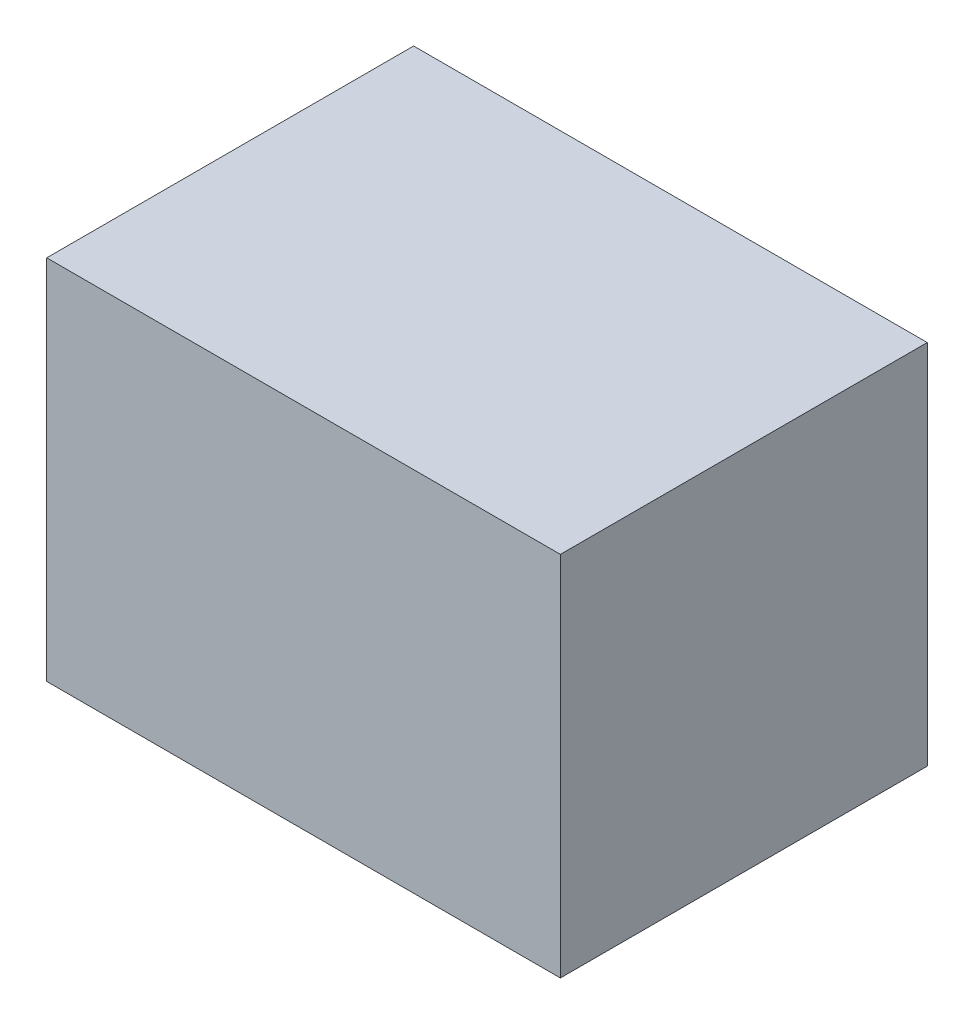
ISO-10303-21;
HEADER;
FILE_DESCRIPTION(('STEP AP214'),'2;1');
FILE_NAME('part.step','',(''),(''),'','','');
FILE_SCHEMA(('AUTOMOTIVE_DESIGN { 1 0 10303 214 1 1 1 1 }'));
ENDSEC;
DATA;
#1=APPLICATION_CONTEXT('core data for automotive mechanical design processes');
#2=APPLICATION_PROTOCOL_DEFINITION('international standard','automotive_design',2000,#1);
#3=PRODUCT_CONTEXT('',#1,'mechanical');
#4=PRODUCT('Part','Part','',(#3));
#5=PRODUCT_RELATED_PRODUCT_CATEGORY('part','',(#4));
#6=PRODUCT_DEFINITION_FORMATION('','',#4);
#7=PRODUCT_DEFINITION_CONTEXT('part definition',#1,'design');
#8=PRODUCT_DEFINITION('design','',#6,#7);
#9=PRODUCT_DEFINITION_SHAPE('','',#8);
#10=(LENGTH_UNIT() NAMED_UNIT(*) SI_UNIT(.MILLI.,.METRE.));
#11=(NAMED_UNIT(*) PLANE_ANGLE_UNIT() SI_UNIT($,.RADIAN.));
#12=(NAMED_UNIT(*) SI_UNIT($,.STERADIAN.) SOLID_ANGLE_UNIT());
#13=UNCERTAINTY_MEASURE_WITH_UNIT(LENGTH_MEASURE(1.E-05),#10,'distance_accuracy_value','');
#14=(GEOMETRIC_REPRESENTATION_CONTEXT(3) GLOBAL_UNCERTAINTY_ASSIGNED_CONTEXT((#13)) GLOBAL_UNIT_ASSIGNED_CONTEXT((#10,
#11,#12)) REPRESENTATION_CONTEXT('',''));
#15=CARTESIAN_POINT('',(0.,0.,0.));
#16=DIRECTION('',(0.,0.,1.));
#17=DIRECTION('',(1.,0.,0.));
#18=AXIS2_PLACEMENT_3D('',#15,#16,#17);
#19=CARTESIAN_POINT('',(53.34,0.,0.));
#20=DIRECTION('',(0.,0.,-1.));
#21=DIRECTION('',(-1.,0.,0.));
#22=AXIS2_PLACEMENT_3D('',#19,#20,#21);
#23=PLANE('',#22);
#24=DIRECTION('',(0.,-1.,0.));
#25=VECTOR('',#24,1.);
#26=CARTESIAN_POINT('',(0.,0.,0.));
#27=LINE('',#26,#25);
#28=CARTESIAN_POINT('',(0.,38.1,0.));
#29=VERTEX_POINT('',#28);
#30=CARTESIAN_POINT('',(0.,0.,0.));
#31=VERTEX_POINT('',#30);
#32=EDGE_CURVE('E113',#29,#31,#27,.T.);
#33=ORIENTED_EDGE('',*,*,#32,.T.);
#34=DIRECTION('',(-1.,0.,0.));
#35=VECTOR('',#34,1.);
#36=CARTESIAN_POINT('',(53.34,0.,0.));
#37=LINE('',#36,#35);
#38=CARTESIAN_POINT('',(53.34,0.,0.));
#39=VERTEX_POINT('',#38);
#40=EDGE_CURVE('E11',#39,#31,#37,.T.);
#41=ORIENTED_EDGE('',*,*,#40,.F.);
#42=DIRECTION('',(0.,-1.,0.));
#43=VECTOR('',#42,1.);
#44=CARTESIAN_POINT('',(53.34,0.,0.));
#45=LINE('',#44,#43);
#46=CARTESIAN_POINT('',(53.34,38.1,0.));
#47=VERTEX_POINT('',#46);
#48=EDGE_CURVE('E97',#47,#39,#45,.T.);
#49=ORIENTED_EDGE('',*,*,#48,.F.);
#50=DIRECTION('',(-1.,0.,0.));
#51=VECTOR('',#50,1.);
#52=CARTESIAN_POINT('',(53.34,38.1,0.));
#53=LINE('',#52,#51);
#54=EDGE_CURVE('E109',#47,#29,#53,.T.);
#55=ORIENTED_EDGE('',*,*,#54,.T.);
#56=EDGE_LOOP('',(#33,#41,#49,#55));
#57=FACE_BOUND('',#56,.T.);
#58=ADVANCED_FACE('F45',(#57),#23,.F.);
#59=CARTESIAN_POINT('',(53.34,0.,0.));
#60=DIRECTION('',(0.,1.,0.));
#61=DIRECTION('',(0.,0.,1.));
#62=AXIS2_PLACEMENT_3D('',#59,#60,#61);
#63=PLANE('',#62);
#64=DIRECTION('',(0.,0.,-1.));
#65=VECTOR('',#64,1.);
#66=CARTESIAN_POINT('',(0.,0.,0.));
#67=LINE('',#66,#65);
#68=CARTESIAN_POINT('',(0.,0.,-38.1));
#69=VERTEX_POINT('',#68);
#70=EDGE_CURVE('E102',#31,#69,#67,.T.);
#71=ORIENTED_EDGE('',*,*,#70,.T.);
#72=DIRECTION('',(-1.,0.,0.));
#73=VECTOR('',#72,1.);
#74=CARTESIAN_POINT('',(53.34,0.,-38.1));
#75=LINE('',#74,#73);
#76=CARTESIAN_POINT('',(53.34,0.,-38.1));
#77=VERTEX_POINT('',#76);
#78=EDGE_CURVE('E54',#77,#69,#75,.T.);
#79=ORIENTED_EDGE('',*,*,#78,.F.);
#80=DIRECTION('',(0.,0.,-1.));
#81=VECTOR('',#80,1.);
#82=CARTESIAN_POINT('',(53.34,0.,0.));
#83=LINE('',#82,#81);
#84=EDGE_CURVE('E92',#39,#77,#83,.T.);
#85=ORIENTED_EDGE('',*,*,#84,.F.);
#86=ORIENTED_EDGE('',*,*,#40,.T.);
#87=EDGE_LOOP('',(#71,#79,#85,#86));
#88=FACE_BOUND('',#87,.T.);
#89=ADVANCED_FACE('F101',(#88),#63,.F.);
#90=CARTESIAN_POINT('',(53.34,0.,-38.1));
#91=DIRECTION('',(0.,0.,1.));
#92=DIRECTION('',(1.,0.,0.));
#93=AXIS2_PLACEMENT_3D('',#90,#91,#92);
#94=PLANE('',#93);
#95=DIRECTION('',(0.,1.,0.));
#96=VECTOR('',#95,1.);
#97=CARTESIAN_POINT('',(0.,0.,-38.1));
#98=LINE('',#97,#96);
#99=CARTESIAN_POINT('',(0.,38.1,-38.1));
#100=VERTEX_POINT('',#99);
#101=EDGE_CURVE('E79',#69,#100,#98,.T.);
#102=ORIENTED_EDGE('',*,*,#101,.T.);
#103=DIRECTION('',(-1.,0.,0.));
#104=VECTOR('',#103,1.);
#105=CARTESIAN_POINT('',(53.34,38.1,-38.1));
#106=LINE('',#105,#104);
#107=CARTESIAN_POINT('',(53.34,38.1,-38.1));
#108=VERTEX_POINT('',#107);
#109=EDGE_CURVE('E104',#108,#100,#106,.T.);
#110=ORIENTED_EDGE('',*,*,#109,.F.);
#111=DIRECTION('',(0.,1.,0.));
#112=VECTOR('',#111,1.);
#113=CARTESIAN_POINT('',(53.34,0.,-38.1));
#114=LINE('',#113,#112);
#115=EDGE_CURVE('E95',#77,#108,#114,.T.);
#116=ORIENTED_EDGE('',*,*,#115,.F.);
#117=ORIENTED_EDGE('',*,*,#78,.T.);
#118=EDGE_LOOP('',(#102,#110,#116,#117));
#119=FACE_BOUND('',#118,.T.);
#120=ADVANCED_FACE('F105',(#119),#94,.F.);
#121=CARTESIAN_POINT('',(53.34,38.1,0.));
#122=DIRECTION('',(0.,-1.,0.));
#123=DIRECTION('',(0.,0.,-1.));
#124=AXIS2_PLACEMENT_3D('',#121,#122,#123);
#125=PLANE('',#124);
#126=DIRECTION('',(0.,0.,1.));
#127=VECTOR('',#126,1.);
#128=CARTESIAN_POINT('',(0.,38.1,0.));
#129=LINE('',#128,#127);
#130=EDGE_CURVE('E85',#100,#29,#129,.T.);
#131=ORIENTED_EDGE('',*,*,#130,.T.);
#132=ORIENTED_EDGE('',*,*,#54,.F.);
#133=DIRECTION('',(0.,0.,1.));
#134=VECTOR('',#133,1.);
#135=CARTESIAN_POINT('',(53.34,38.1,0.));
#136=LINE('',#135,#134);
#137=EDGE_CURVE('E62',#108,#47,#136,.T.);
#138=ORIENTED_EDGE('',*,*,#137,.F.);
#139=ORIENTED_EDGE('',*,*,#109,.T.);
#140=EDGE_LOOP('',(#131,#132,#138,#139));
#141=FACE_BOUND('',#140,.T.);
#142=ADVANCED_FACE('F126',(#141),#125,.F.);
#143=CARTESIAN_POINT('',(53.34,0.,0.));
#144=DIRECTION('',(-1.,0.,0.));
#145=DIRECTION('',(0.,0.,1.));
#146=AXIS2_PLACEMENT_3D('',#143,#144,#145);
#147=PLANE('',#146);
#148=ORIENTED_EDGE('',*,*,#48,.T.);
#149=ORIENTED_EDGE('',*,*,#84,.T.);
#150=ORIENTED_EDGE('',*,*,#115,.T.);
#151=ORIENTED_EDGE('',*,*,#137,.T.);
#152=EDGE_LOOP('',(#148,#149,#150,#151));
#153=FACE_BOUND('',#152,.T.);
#154=ADVANCED_FACE('F93',(#153),#147,.F.);
#155=CARTESIAN_POINT('',(0.,0.,0.));
#156=DIRECTION('',(-1.,0.,0.));
#157=DIRECTION('',(0.,0.,1.));
#158=AXIS2_PLACEMENT_3D('',#155,#156,#157);
#159=PLANE('',#158);
#160=ORIENTED_EDGE('',*,*,#32,.F.);
#161=ORIENTED_EDGE('',*,*,#130,.F.);
#162=ORIENTED_EDGE('',*,*,#101,.F.);
#163=ORIENTED_EDGE('',*,*,#70,.F.);
#164=EDGE_LOOP('',(#160,#161,#162,#163));
#165=FACE_BOUND('',#164,.T.);
#166=ADVANCED_FACE('F129',(#165),#159,.T.);
#167=CLOSED_SHELL('',(#58,#89,#120,#142,#154,#166));
#168=MANIFOLD_SOLID_BREP('B2',#167);
#169=ADVANCED_BREP_SHAPE_REPRESENTATION('',(#18,#168),#14);
#170=SHAPE_DEFINITION_REPRESENTATION(#9,#169);
ENDSEC;
END-ISO-10303-21;
